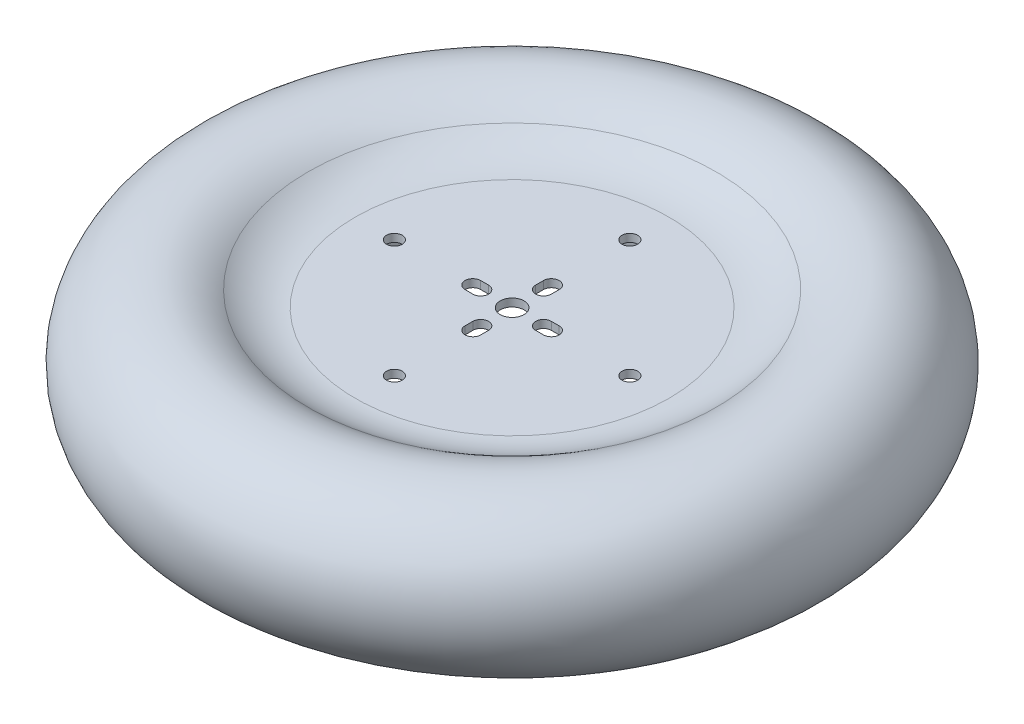
ISO-10303-21;
HEADER;
FILE_DESCRIPTION(('STEP AP214'),'2;1');
FILE_NAME('part.step','',(''),(''),'','','');
FILE_SCHEMA(('AUTOMOTIVE_DESIGN { 1 0 10303 214 1 1 1 1 }'));
ENDSEC;
DATA;
#1=APPLICATION_CONTEXT('core data for automotive mechanical design processes');
#2=APPLICATION_PROTOCOL_DEFINITION('international standard','automotive_design',2000,#1);
#3=PRODUCT_CONTEXT('',#1,'mechanical');
#4=PRODUCT('Part','Part','',(#3));
#5=PRODUCT_RELATED_PRODUCT_CATEGORY('part','',(#4));
#6=PRODUCT_DEFINITION_FORMATION('','',#4);
#7=PRODUCT_DEFINITION_CONTEXT('part definition',#1,'design');
#8=PRODUCT_DEFINITION('design','',#6,#7);
#9=PRODUCT_DEFINITION_SHAPE('','',#8);
#10=(LENGTH_UNIT() NAMED_UNIT(*) SI_UNIT(.MILLI.,.METRE.));
#11=(NAMED_UNIT(*) PLANE_ANGLE_UNIT() SI_UNIT($,.RADIAN.));
#12=(NAMED_UNIT(*) SI_UNIT($,.STERADIAN.) SOLID_ANGLE_UNIT());
#13=UNCERTAINTY_MEASURE_WITH_UNIT(LENGTH_MEASURE(1.E-05),#10,'distance_accuracy_value','');
#14=(GEOMETRIC_REPRESENTATION_CONTEXT(3) GLOBAL_UNCERTAINTY_ASSIGNED_CONTEXT((#13)) GLOBAL_UNIT_ASSIGNED_CONTEXT((#10,
#11,#12)) REPRESENTATION_CONTEXT('',''));
#15=CARTESIAN_POINT('',(0.,0.,0.));
#16=DIRECTION('',(0.,0.,1.));
#17=DIRECTION('',(1.,0.,0.));
#18=AXIS2_PLACEMENT_3D('',#15,#16,#17);
#19=CARTESIAN_POINT('',(0.,30.,0.));
#20=DIRECTION('',(0.,1.,0.));
#21=DIRECTION('',(-1.,0.,0.));
#22=AXIS2_PLACEMENT_3D('',#19,#20,#21);
#23=PLANE('',#22);
#24=CARTESIAN_POINT('',(-74.9999999999994,30.,5.77662917500277E-13));
#25=DIRECTION('',(0.,1.,0.));
#26=DIRECTION('',(-1.,0.,0.));
#27=AXIS2_PLACEMENT_3D('',#24,#25,#26);
#28=CIRCLE('',#27,5.);
#29=CARTESIAN_POINT('',(-79.9999999999994,30.,5.77662917500277E-13));
#30=VERTEX_POINT('',#29);
#31=EDGE_CURVE('E205',#30,#30,#28,.T.);
#32=ORIENTED_EDGE('',*,*,#31,.F.);
#33=EDGE_LOOP('',(#32));
#34=FACE_BOUND('',#33,.T.);
#35=DIRECTION('',(-1.,0.,0.));
#36=VECTOR('',#35,1.);
#37=CARTESIAN_POINT('',(0.,30.,-4.99999999999945));
#38=LINE('',#37,#36);
#39=CARTESIAN_POINT('',(-19.9999999999994,30.,-4.99999999999944));
#40=VERTEX_POINT('',#39);
#41=CARTESIAN_POINT('',(-24.9999999999994,30.,-4.99999999999944));
#42=VERTEX_POINT('',#41);
#43=EDGE_CURVE('E48',#40,#42,#38,.T.);
#44=ORIENTED_EDGE('',*,*,#43,.F.);
#45=CARTESIAN_POINT('',(-19.9999999999994,30.,5.62050406216485E-13));
#46=DIRECTION('',(0.,1.,0.));
#47=DIRECTION('',(-1.,0.,0.));
#48=AXIS2_PLACEMENT_3D('',#45,#46,#47);
#49=CIRCLE('',#48,5.);
#50=CARTESIAN_POINT('',(-19.9999999999994,30.,5.00000000000056));
#51=VERTEX_POINT('',#50);
#52=EDGE_CURVE('E192',#51,#40,#49,.T.);
#53=ORIENTED_EDGE('',*,*,#52,.F.);
#54=DIRECTION('',(-1.,0.,0.));
#55=VECTOR('',#54,1.);
#56=CARTESIAN_POINT('',(0.,30.,5.00000000000056));
#57=LINE('',#56,#55);
#58=CARTESIAN_POINT('',(-24.9999999999994,30.,5.00000000000056));
#59=VERTEX_POINT('',#58);
#60=EDGE_CURVE('E189',#51,#59,#57,.T.);
#61=ORIENTED_EDGE('',*,*,#60,.T.);
#62=CARTESIAN_POINT('',(-24.9999999999994,30.,5.62004792912557E-13));
#63=DIRECTION('',(0.,1.,0.));
#64=DIRECTION('',(-1.,0.,0.));
#65=AXIS2_PLACEMENT_3D('',#62,#63,#64);
#66=CIRCLE('',#65,5.);
#67=EDGE_CURVE('E186',#42,#59,#66,.T.);
#68=ORIENTED_EDGE('',*,*,#67,.F.);
#69=EDGE_LOOP('',(#44,#53,#61,#68));
#70=FACE_BOUND('',#69,.T.);
#71=CARTESIAN_POINT('',(0.,30.,-75.));
#72=DIRECTION('',(0.,1.,0.));
#73=DIRECTION('',(-1.,0.,0.));
#74=AXIS2_PLACEMENT_3D('',#71,#72,#73);
#75=CIRCLE('',#74,5.);
#76=CARTESIAN_POINT('',(-4.99999999999999,30.,-75.));
#77=VERTEX_POINT('',#76);
#78=EDGE_CURVE('E181',#77,#77,#75,.T.);
#79=ORIENTED_EDGE('',*,*,#78,.F.);
#80=EDGE_LOOP('',(#79));
#81=FACE_BOUND('',#80,.T.);
#82=CARTESIAN_POINT('',(1.15095181540636E-12,30.,75.));
#83=DIRECTION('',(0.,1.,0.));
#84=DIRECTION('',(-1.,0.,0.));
#85=AXIS2_PLACEMENT_3D('',#82,#83,#84);
#86=CIRCLE('',#85,5.00000000000001);
#87=CARTESIAN_POINT('',(-4.99999999999886,30.,75.));
#88=VERTEX_POINT('',#87);
#89=EDGE_CURVE('E178',#88,#88,#86,.T.);
#90=ORIENTED_EDGE('',*,*,#89,.F.);
#91=EDGE_LOOP('',(#90));
#92=FACE_BOUND('',#91,.T.);
#93=DIRECTION('',(0.,0.,1.));
#94=VECTOR('',#93,1.);
#95=CARTESIAN_POINT('',(-4.99999999999885,30.,0.));
#96=LINE('',#95,#94);
#97=CARTESIAN_POINT('',(-4.99999999999885,30.,20.));
#98=VERTEX_POINT('',#97);
#99=CARTESIAN_POINT('',(-4.99999999999886,30.,25.));
#100=VERTEX_POINT('',#99);
#101=EDGE_CURVE('E56',#98,#100,#96,.T.);
#102=ORIENTED_EDGE('',*,*,#101,.F.);
#103=CARTESIAN_POINT('',(1.14421625801104E-12,30.,20.));
#104=DIRECTION('',(0.,1.,0.));
#105=DIRECTION('',(-1.,0.,0.));
#106=AXIS2_PLACEMENT_3D('',#103,#104,#105);
#107=CIRCLE('',#106,5.);
#108=CARTESIAN_POINT('',(5.00000000000114,30.,20.));
#109=VERTEX_POINT('',#108);
#110=EDGE_CURVE('E168',#109,#98,#107,.T.);
#111=ORIENTED_EDGE('',*,*,#110,.F.);
#112=DIRECTION('',(0.,0.,1.));
#113=VECTOR('',#112,1.);
#114=CARTESIAN_POINT('',(5.00000000000114,30.,0.));
#115=LINE('',#114,#113);
#116=CARTESIAN_POINT('',(5.00000000000114,30.,25.));
#117=VERTEX_POINT('',#116);
#118=EDGE_CURVE('E152',#109,#117,#115,.T.);
#119=ORIENTED_EDGE('',*,*,#118,.T.);
#120=CARTESIAN_POINT('',(1.14482858141062E-12,30.,25.));
#121=DIRECTION('',(0.,1.,0.));
#122=DIRECTION('',(-1.,0.,0.));
#123=AXIS2_PLACEMENT_3D('',#120,#121,#122);
#124=CIRCLE('',#123,5.);
#125=EDGE_CURVE('E162',#100,#117,#124,.T.);
#126=ORIENTED_EDGE('',*,*,#125,.F.);
#127=EDGE_LOOP('',(#102,#111,#119,#126));
#128=FACE_BOUND('',#127,.T.);
#129=DIRECTION('',(1.,0.,0.));
#130=VECTOR('',#129,1.);
#131=CARTESIAN_POINT('',(0.,30.,4.99999999999947));
#132=LINE('',#131,#130);
#133=CARTESIAN_POINT('',(20.0000000000006,30.,4.99999999999944));
#134=VERTEX_POINT('',#133);
#135=CARTESIAN_POINT('',(25.0000000000006,30.,4.99999999999944));
#136=VERTEX_POINT('',#135);
#137=EDGE_CURVE('E175',#134,#136,#132,.T.);
#138=ORIENTED_EDGE('',*,*,#137,.F.);
#139=CARTESIAN_POINT('',(20.0000000000006,30.,-5.64652491430451E-13));
#140=DIRECTION('',(0.,1.,0.));
#141=DIRECTION('',(-1.,0.,0.));
#142=AXIS2_PLACEMENT_3D('',#139,#140,#141);
#143=CIRCLE('',#142,5.);
#144=CARTESIAN_POINT('',(20.0000000000006,30.,-5.00000000000057));
#145=VERTEX_POINT('',#144);
#146=EDGE_CURVE('E237',#145,#134,#143,.T.);
#147=ORIENTED_EDGE('',*,*,#146,.F.);
#148=DIRECTION('',(1.,0.,0.));
#149=VECTOR('',#148,1.);
#150=CARTESIAN_POINT('',(0.,30.,-5.00000000000058));
#151=LINE('',#150,#149);
#152=CARTESIAN_POINT('',(25.0000000000006,30.,-5.00000000000057));
#153=VERTEX_POINT('',#152);
#154=EDGE_CURVE('E234',#145,#153,#151,.T.);
#155=ORIENTED_EDGE('',*,*,#154,.T.);
#156=CARTESIAN_POINT('',(25.0000000000006,30.,-5.65066409910425E-13));
#157=DIRECTION('',(0.,1.,0.));
#158=DIRECTION('',(-1.,0.,0.));
#159=AXIS2_PLACEMENT_3D('',#156,#157,#158);
#160=CIRCLE('',#159,5.);
#161=EDGE_CURVE('E231',#136,#153,#160,.T.);
#162=ORIENTED_EDGE('',*,*,#161,.F.);
#163=EDGE_LOOP('',(#138,#147,#155,#162));
#164=FACE_BOUND('',#163,.T.);
#165=CARTESIAN_POINT('',(75.0000000000006,29.9999999999999,-5.68121938382404E-13));
#166=DIRECTION('',(0.,1.,0.));
#167=DIRECTION('',(-1.,0.,0.));
#168=AXIS2_PLACEMENT_3D('',#165,#166,#167);
#169=CIRCLE('',#168,5.);
#170=CARTESIAN_POINT('',(70.0000000000006,29.9999999999999,-5.68121938382404E-13));
#171=VERTEX_POINT('',#170);
#172=EDGE_CURVE('E210',#171,#171,#169,.T.);
#173=ORIENTED_EDGE('',*,*,#172,.F.);
#174=EDGE_LOOP('',(#173));
#175=FACE_BOUND('',#174,.T.);
#176=DIRECTION('',(0.,0.,-1.));
#177=VECTOR('',#176,1.);
#178=CARTESIAN_POINT('',(5.00000000000002,30.,0.));
#179=LINE('',#178,#177);
#180=CARTESIAN_POINT('',(5.00000000000002,30.,-20.));
#181=VERTEX_POINT('',#180);
#182=CARTESIAN_POINT('',(5.00000000000002,30.,-25.));
#183=VERTEX_POINT('',#182);
#184=EDGE_CURVE('E207',#181,#183,#179,.T.);
#185=ORIENTED_EDGE('',*,*,#184,.F.);
#186=CARTESIAN_POINT('',(0.,30.,-20.));
#187=DIRECTION('',(0.,1.,0.));
#188=DIRECTION('',(-1.,0.,0.));
#189=AXIS2_PLACEMENT_3D('',#186,#187,#188);
#190=CIRCLE('',#189,5.);
#191=CARTESIAN_POINT('',(-4.99999999999999,30.,-20.));
#192=VERTEX_POINT('',#191);
#193=EDGE_CURVE('E216',#192,#181,#190,.T.);
#194=ORIENTED_EDGE('',*,*,#193,.F.);
#195=DIRECTION('',(0.,0.,-1.));
#196=VECTOR('',#195,1.);
#197=CARTESIAN_POINT('',(-4.99999999999999,30.,0.));
#198=LINE('',#197,#196);
#199=CARTESIAN_POINT('',(-4.99999999999999,30.,-25.));
#200=VERTEX_POINT('',#199);
#201=EDGE_CURVE('E213',#192,#200,#198,.T.);
#202=ORIENTED_EDGE('',*,*,#201,.T.);
#203=CARTESIAN_POINT('',(0.,30.,-25.));
#204=DIRECTION('',(0.,1.,0.));
#205=DIRECTION('',(-1.,0.,0.));
#206=AXIS2_PLACEMENT_3D('',#203,#204,#205);
#207=CIRCLE('',#206,5.);
#208=EDGE_CURVE('E209',#183,#200,#207,.T.);
#209=ORIENTED_EDGE('',*,*,#208,.F.);
#210=EDGE_LOOP('',(#185,#194,#202,#209));
#211=FACE_BOUND('',#210,.T.);
#212=CARTESIAN_POINT('',(0.,30.,0.));
#213=DIRECTION('',(0.,1.,0.));
#214=DIRECTION('',(-1.,0.,0.));
#215=AXIS2_PLACEMENT_3D('',#212,#213,#214);
#216=CIRCLE('',#215,7.59670592104724);
#217=CARTESIAN_POINT('',(-7.59670592104723,30.,0.));
#218=VERTEX_POINT('',#217);
#219=EDGE_CURVE('E202',#218,#218,#216,.T.);
#220=ORIENTED_EDGE('',*,*,#219,.F.);
#221=EDGE_LOOP('',(#220));
#222=FACE_BOUND('',#221,.T.);
#223=CARTESIAN_POINT('',(0.,29.9999999999999,0.));
#224=DIRECTION('',(0.,1.,0.));
#225=DIRECTION('',(-1.,0.,0.));
#226=AXIS2_PLACEMENT_3D('',#223,#224,#225);
#227=CIRCLE('',#226,100.);
#228=CARTESIAN_POINT('',(-100.,30.,0.));
#229=VERTEX_POINT('',#228);
#230=EDGE_CURVE('E257',#229,#229,#227,.T.);
#231=ORIENTED_EDGE('',*,*,#230,.T.);
#232=EDGE_LOOP('',(#231));
#233=FACE_BOUND('',#232,.T.);
#234=ADVANCED_FACE('F33',(#34,#70,#81,#92,#128,#164,#175,#211,#222,#233),#23,.T.);
#235=CARTESIAN_POINT('',(0.,80.,0.));
#236=DIRECTION('',(0.,1.,0.));
#237=DIRECTION('',(-1.,0.,0.));
#238=AXIS2_PLACEMENT_3D('',#235,#236,#237);
#239=TOROIDAL_SURFACE('',#238,100.,50.);
#240=CARTESIAN_POINT('',(0.,39.9999999999999,0.));
#241=DIRECTION('',(0.,1.,0.));
#242=DIRECTION('',(-1.,0.,0.));
#243=AXIS2_PLACEMENT_3D('',#240,#241,#242);
#244=CIRCLE('',#243,130.);
#245=CARTESIAN_POINT('',(-130.,40.,0.));
#246=VERTEX_POINT('',#245);
#247=EDGE_CURVE('E254',#246,#246,#244,.T.);
#248=ORIENTED_EDGE('',*,*,#247,.T.);
#249=EDGE_LOOP('',(#248));
#250=FACE_BOUND('',#249,.T.);
#251=ORIENTED_EDGE('',*,*,#230,.F.);
#252=EDGE_LOOP('',(#251));
#253=FACE_BOUND('',#252,.T.);
#254=ADVANCED_FACE('F324',(#250,#253),#239,.F.);
#255=CARTESIAN_POINT('',(0.,0.,0.));
#256=DIRECTION('',(0.,1.,0.));
#257=DIRECTION('',(-1.,0.,0.));
#258=AXIS2_PLACEMENT_3D('',#255,#256,#257);
#259=TOROIDAL_SURFACE('',#258,160.,50.);
#260=CARTESIAN_POINT('',(0.,0.,0.));
#261=DIRECTION('',(0.,1.,0.));
#262=DIRECTION('',(-1.,0.,0.));
#263=AXIS2_PLACEMENT_3D('',#260,#261,#262);
#264=CIRCLE('',#263,110.);
#265=CARTESIAN_POINT('',(-110.,0.,0.));
#266=VERTEX_POINT('',#265);
#267=EDGE_CURVE('E251',#266,#266,#264,.T.);
#268=ORIENTED_EDGE('',*,*,#267,.T.);
#269=EDGE_LOOP('',(#268));
#270=FACE_BOUND('',#269,.T.);
#271=ORIENTED_EDGE('',*,*,#247,.F.);
#272=EDGE_LOOP('',(#271));
#273=FACE_BOUND('',#272,.T.);
#274=ADVANCED_FACE('F400',(#270,#273),#259,.T.);
#275=CARTESIAN_POINT('',(0.,0.,0.));
#276=DIRECTION('',(0.,1.,0.));
#277=DIRECTION('',(-1.,0.,0.));
#278=AXIS2_PLACEMENT_3D('',#275,#276,#277);
#279=TOROIDAL_SURFACE('',#278,85.,25.);
#280=CARTESIAN_POINT('',(0.,25.,0.));
#281=DIRECTION('',(0.,1.,0.));
#282=DIRECTION('',(-1.,0.,0.));
#283=AXIS2_PLACEMENT_3D('',#280,#281,#282);
#284=CIRCLE('',#283,85.);
#285=CARTESIAN_POINT('',(-85.,25.,0.));
#286=VERTEX_POINT('',#285);
#287=EDGE_CURVE('E248',#286,#286,#284,.T.);
#288=ORIENTED_EDGE('',*,*,#287,.T.);
#289=EDGE_LOOP('',(#288));
#290=FACE_BOUND('',#289,.T.);
#291=ORIENTED_EDGE('',*,*,#267,.F.);
#292=EDGE_LOOP('',(#291));
#293=FACE_BOUND('',#292,.T.);
#294=ADVANCED_FACE('F396',(#290,#293),#279,.F.);
#295=CARTESIAN_POINT('',(-85.,25.,0.));
#296=DIRECTION('',(0.,-1.,0.));
#297=DIRECTION('',(1.,0.,0.));
#298=AXIS2_PLACEMENT_3D('',#295,#296,#297);
#299=PLANE('',#298);
#300=CARTESIAN_POINT('',(-74.9999999999994,25.,5.77662917500277E-13));
#301=DIRECTION('',(0.,-1.,0.));
#302=DIRECTION('',(1.,0.,0.));
#303=AXIS2_PLACEMENT_3D('',#300,#301,#302);
#304=CIRCLE('',#303,5.);
#305=CARTESIAN_POINT('',(-69.9999999999994,25.,5.77662917500277E-13));
#306=VERTEX_POINT('',#305);
#307=EDGE_CURVE('E36',#306,#306,#304,.T.);
#308=ORIENTED_EDGE('',*,*,#307,.F.);
#309=EDGE_LOOP('',(#308));
#310=FACE_BOUND('',#309,.T.);
#311=DIRECTION('',(1.,0.,0.));
#312=VECTOR('',#311,1.);
#313=CARTESIAN_POINT('',(-85.,25.,-4.99999999999942));
#314=LINE('',#313,#312);
#315=CARTESIAN_POINT('',(-24.9999999999994,25.,-4.99999999999944));
#316=VERTEX_POINT('',#315);
#317=CARTESIAN_POINT('',(-19.9999999999994,25.,-4.99999999999944));
#318=VERTEX_POINT('',#317);
#319=EDGE_CURVE('E11',#316,#318,#314,.T.);
#320=ORIENTED_EDGE('',*,*,#319,.F.);
#321=CARTESIAN_POINT('',(-24.9999999999994,25.,5.62004792912557E-13));
#322=DIRECTION('',(0.,-1.,0.));
#323=DIRECTION('',(1.,0.,0.));
#324=AXIS2_PLACEMENT_3D('',#321,#322,#323);
#325=CIRCLE('',#324,5.);
#326=CARTESIAN_POINT('',(-24.9999999999994,25.,5.00000000000056));
#327=VERTEX_POINT('',#326);
#328=EDGE_CURVE('E292',#327,#316,#325,.T.);
#329=ORIENTED_EDGE('',*,*,#328,.F.);
#330=DIRECTION('',(1.,0.,0.));
#331=VECTOR('',#330,1.);
#332=CARTESIAN_POINT('',(-85.,25.,5.00000000000058));
#333=LINE('',#332,#331);
#334=CARTESIAN_POINT('',(-19.9999999999994,25.,5.00000000000056));
#335=VERTEX_POINT('',#334);
#336=EDGE_CURVE('E299',#327,#335,#333,.T.);
#337=ORIENTED_EDGE('',*,*,#336,.T.);
#338=CARTESIAN_POINT('',(-19.9999999999994,25.,5.62050406216485E-13));
#339=DIRECTION('',(0.,-1.,0.));
#340=DIRECTION('',(1.,0.,0.));
#341=AXIS2_PLACEMENT_3D('',#338,#339,#340);
#342=CIRCLE('',#341,5.);
#343=EDGE_CURVE('E41',#318,#335,#342,.T.);
#344=ORIENTED_EDGE('',*,*,#343,.F.);
#345=EDGE_LOOP('',(#320,#329,#337,#344));
#346=FACE_BOUND('',#345,.T.);
#347=CARTESIAN_POINT('',(0.,25.,-75.));
#348=DIRECTION('',(0.,-1.,0.));
#349=DIRECTION('',(1.,0.,0.));
#350=AXIS2_PLACEMENT_3D('',#347,#348,#349);
#351=CIRCLE('',#350,5.);
#352=CARTESIAN_POINT('',(5.00000000000002,25.,-75.));
#353=VERTEX_POINT('',#352);
#354=EDGE_CURVE('E295',#353,#353,#351,.T.);
#355=ORIENTED_EDGE('',*,*,#354,.F.);
#356=EDGE_LOOP('',(#355));
#357=FACE_BOUND('',#356,.T.);
#358=CARTESIAN_POINT('',(1.14850252180806E-12,25.,75.));
#359=DIRECTION('',(0.,-1.,0.));
#360=DIRECTION('',(1.,0.,0.));
#361=AXIS2_PLACEMENT_3D('',#358,#359,#360);
#362=CIRCLE('',#361,5.00000000000001);
#363=CARTESIAN_POINT('',(5.00000000000116,25.,75.));
#364=VERTEX_POINT('',#363);
#365=EDGE_CURVE('E276',#364,#364,#362,.T.);
#366=ORIENTED_EDGE('',*,*,#365,.F.);
#367=EDGE_LOOP('',(#366));
#368=FACE_BOUND('',#367,.T.);
#369=DIRECTION('',(0.,0.,-1.));
#370=VECTOR('',#369,1.);
#371=CARTESIAN_POINT('',(-4.99999999999885,25.,0.));
#372=LINE('',#371,#370);
#373=CARTESIAN_POINT('',(-4.99999999999886,25.,25.));
#374=VERTEX_POINT('',#373);
#375=CARTESIAN_POINT('',(-4.99999999999886,25.,20.));
#376=VERTEX_POINT('',#375);
#377=EDGE_CURVE('E290',#374,#376,#372,.T.);
#378=ORIENTED_EDGE('',*,*,#377,.F.);
#379=CARTESIAN_POINT('',(1.14237928781232E-12,25.,25.));
#380=DIRECTION('',(0.,-1.,0.));
#381=DIRECTION('',(1.,0.,0.));
#382=AXIS2_PLACEMENT_3D('',#379,#380,#381);
#383=CIRCLE('',#382,5.);
#384=CARTESIAN_POINT('',(5.00000000000114,25.,25.));
#385=VERTEX_POINT('',#384);
#386=EDGE_CURVE('E285',#385,#374,#383,.T.);
#387=ORIENTED_EDGE('',*,*,#386,.F.);
#388=DIRECTION('',(0.,0.,-1.));
#389=VECTOR('',#388,1.);
#390=CARTESIAN_POINT('',(5.00000000000113,25.,0.));
#391=LINE('',#390,#389);
#392=CARTESIAN_POINT('',(5.00000000000114,25.,20.));
#393=VERTEX_POINT('',#392);
#394=EDGE_CURVE('E155',#385,#393,#391,.T.);
#395=ORIENTED_EDGE('',*,*,#394,.T.);
#396=CARTESIAN_POINT('',(1.14176696441275E-12,25.,20.));
#397=DIRECTION('',(0.,-1.,0.));
#398=DIRECTION('',(1.,0.,0.));
#399=AXIS2_PLACEMENT_3D('',#396,#397,#398);
#400=CIRCLE('',#399,5.);
#401=EDGE_CURVE('E288',#376,#393,#400,.T.);
#402=ORIENTED_EDGE('',*,*,#401,.F.);
#403=EDGE_LOOP('',(#378,#387,#395,#402));
#404=FACE_BOUND('',#403,.T.);
#405=DIRECTION('',(-1.,0.,0.));
#406=VECTOR('',#405,1.);
#407=CARTESIAN_POINT('',(-85.,25.,4.99999999999959));
#408=LINE('',#407,#406);
#409=CARTESIAN_POINT('',(25.0000000000006,25.,4.99999999999943));
#410=VERTEX_POINT('',#409);
#411=CARTESIAN_POINT('',(20.0000000000006,25.,4.99999999999944));
#412=VERTEX_POINT('',#411);
#413=EDGE_CURVE('E283',#410,#412,#408,.T.);
#414=ORIENTED_EDGE('',*,*,#413,.F.);
#415=CARTESIAN_POINT('',(25.0000000000006,25.,-5.65066409910425E-13));
#416=DIRECTION('',(0.,-1.,0.));
#417=DIRECTION('',(1.,0.,0.));
#418=AXIS2_PLACEMENT_3D('',#415,#416,#417);
#419=CIRCLE('',#418,5.);
#420=CARTESIAN_POINT('',(25.0000000000006,25.,-5.00000000000056));
#421=VERTEX_POINT('',#420);
#422=EDGE_CURVE('E273',#421,#410,#419,.T.);
#423=ORIENTED_EDGE('',*,*,#422,.F.);
#424=DIRECTION('',(-1.,0.,0.));
#425=VECTOR('',#424,1.);
#426=CARTESIAN_POINT('',(-85.,25.,-5.0000000000006));
#427=LINE('',#426,#425);
#428=CARTESIAN_POINT('',(20.0000000000006,25.,-5.00000000000057));
#429=VERTEX_POINT('',#428);
#430=EDGE_CURVE('E278',#421,#429,#427,.T.);
#431=ORIENTED_EDGE('',*,*,#430,.T.);
#432=CARTESIAN_POINT('',(20.0000000000006,25.,-5.64652491430451E-13));
#433=DIRECTION('',(0.,-1.,0.));
#434=DIRECTION('',(1.,0.,0.));
#435=AXIS2_PLACEMENT_3D('',#432,#433,#434);
#436=CIRCLE('',#435,5.);
#437=EDGE_CURVE('E281',#412,#429,#436,.T.);
#438=ORIENTED_EDGE('',*,*,#437,.F.);
#439=EDGE_LOOP('',(#414,#423,#431,#438));
#440=FACE_BOUND('',#439,.T.);
#441=CARTESIAN_POINT('',(75.0000000000006,24.9999999999999,-5.68121938382404E-13));
#442=DIRECTION('',(0.,-1.,0.));
#443=DIRECTION('',(1.,0.,0.));
#444=AXIS2_PLACEMENT_3D('',#441,#442,#443);
#445=CIRCLE('',#444,5.);
#446=CARTESIAN_POINT('',(80.0000000000006,24.9999999999999,-5.68121938382404E-13));
#447=VERTEX_POINT('',#446);
#448=EDGE_CURVE('E264',#447,#447,#445,.T.);
#449=ORIENTED_EDGE('',*,*,#448,.F.);
#450=EDGE_LOOP('',(#449));
#451=FACE_BOUND('',#450,.T.);
#452=DIRECTION('',(0.,0.,1.));
#453=VECTOR('',#452,1.);
#454=CARTESIAN_POINT('',(5.,25.,0.));
#455=LINE('',#454,#453);
#456=CARTESIAN_POINT('',(5.00000000000001,25.,-25.));
#457=VERTEX_POINT('',#456);
#458=CARTESIAN_POINT('',(5.00000000000001,25.,-20.));
#459=VERTEX_POINT('',#458);
#460=EDGE_CURVE('E271',#457,#459,#455,.T.);
#461=ORIENTED_EDGE('',*,*,#460,.F.);
#462=CARTESIAN_POINT('',(0.,25.,-25.));
#463=DIRECTION('',(0.,-1.,0.));
#464=DIRECTION('',(1.,0.,0.));
#465=AXIS2_PLACEMENT_3D('',#462,#463,#464);
#466=CIRCLE('',#465,5.);
#467=CARTESIAN_POINT('',(-4.99999999999999,25.,-25.));
#468=VERTEX_POINT('',#467);
#469=EDGE_CURVE('E260',#468,#457,#466,.T.);
#470=ORIENTED_EDGE('',*,*,#469,.F.);
#471=DIRECTION('',(0.,0.,1.));
#472=VECTOR('',#471,1.);
#473=CARTESIAN_POINT('',(-4.99999999999999,25.,0.));
#474=LINE('',#473,#472);
#475=CARTESIAN_POINT('',(-4.99999999999999,25.,-20.));
#476=VERTEX_POINT('',#475);
#477=EDGE_CURVE('E266',#468,#476,#474,.T.);
#478=ORIENTED_EDGE('',*,*,#477,.T.);
#479=CARTESIAN_POINT('',(0.,25.,-20.));
#480=DIRECTION('',(0.,-1.,0.));
#481=DIRECTION('',(1.,0.,0.));
#482=AXIS2_PLACEMENT_3D('',#479,#480,#481);
#483=CIRCLE('',#482,5.);
#484=EDGE_CURVE('E269',#459,#476,#483,.T.);
#485=ORIENTED_EDGE('',*,*,#484,.F.);
#486=EDGE_LOOP('',(#461,#470,#478,#485));
#487=FACE_BOUND('',#486,.T.);
#488=CARTESIAN_POINT('',(0.,25.,0.));
#489=DIRECTION('',(0.,-1.,0.));
#490=DIRECTION('',(1.,0.,0.));
#491=AXIS2_PLACEMENT_3D('',#488,#489,#490);
#492=CIRCLE('',#491,7.59670592104724);
#493=CARTESIAN_POINT('',(7.59670592104725,25.,0.));
#494=VERTEX_POINT('',#493);
#495=EDGE_CURVE('E261',#494,#494,#492,.T.);
#496=ORIENTED_EDGE('',*,*,#495,.F.);
#497=EDGE_LOOP('',(#496));
#498=FACE_BOUND('',#497,.T.);
#499=ORIENTED_EDGE('',*,*,#287,.F.);
#500=EDGE_LOOP('',(#499));
#501=FACE_BOUND('',#500,.T.);
#502=ADVANCED_FACE('F315',(#310,#346,#357,#368,#404,#440,#451,#487,#498,#501),#299,.T.);
#503=CARTESIAN_POINT('',(0.,20.,0.));
#504=DIRECTION('',(0.,1.,0.));
#505=DIRECTION('',(-1.,0.,0.));
#506=AXIS2_PLACEMENT_3D('',#503,#504,#505);
#507=CYLINDRICAL_SURFACE('',#506,7.59670592104724);
#508=ORIENTED_EDGE('',*,*,#495,.T.);
#509=EDGE_LOOP('',(#508));
#510=FACE_BOUND('',#509,.T.);
#511=ORIENTED_EDGE('',*,*,#219,.T.);
#512=EDGE_LOOP('',(#511));
#513=FACE_BOUND('',#512,.T.);
#514=ADVANCED_FACE('F354',(#510,#513),#507,.F.);
#515=CARTESIAN_POINT('',(5.00000000000001,20.,0.));
#516=DIRECTION('',(1.,0.,0.));
#517=DIRECTION('',(0.,1.,0.));
#518=AXIS2_PLACEMENT_3D('',#515,#516,#517);
#519=PLANE('',#518);
#520=ORIENTED_EDGE('',*,*,#460,.T.);
#521=DIRECTION('',(0.,1.,0.));
#522=VECTOR('',#521,1.);
#523=CARTESIAN_POINT('',(5.00000000000001,20.,-20.));
#524=LINE('',#523,#522);
#525=EDGE_CURVE('E206',#459,#181,#524,.T.);
#526=ORIENTED_EDGE('',*,*,#525,.T.);
#527=ORIENTED_EDGE('',*,*,#184,.T.);
#528=DIRECTION('',(0.,1.,0.));
#529=VECTOR('',#528,1.);
#530=CARTESIAN_POINT('',(5.00000000000001,20.,-25.));
#531=LINE('',#530,#529);
#532=EDGE_CURVE('E219',#457,#183,#531,.T.);
#533=ORIENTED_EDGE('',*,*,#532,.F.);
#534=EDGE_LOOP('',(#520,#526,#527,#533));
#535=FACE_BOUND('',#534,.T.);
#536=ADVANCED_FACE('F357',(#535),#519,.F.);
#537=CARTESIAN_POINT('',(0.,20.,-20.));
#538=DIRECTION('',(0.,1.,0.));
#539=DIRECTION('',(-1.,0.,0.));
#540=AXIS2_PLACEMENT_3D('',#537,#538,#539);
#541=CYLINDRICAL_SURFACE('',#540,5.);
#542=ORIENTED_EDGE('',*,*,#484,.T.);
#543=DIRECTION('',(0.,1.,0.));
#544=VECTOR('',#543,1.);
#545=CARTESIAN_POINT('',(-4.99999999999999,20.,-20.));
#546=LINE('',#545,#544);
#547=EDGE_CURVE('E221',#476,#192,#546,.T.);
#548=ORIENTED_EDGE('',*,*,#547,.T.);
#549=ORIENTED_EDGE('',*,*,#193,.T.);
#550=ORIENTED_EDGE('',*,*,#525,.F.);
#551=EDGE_LOOP('',(#542,#548,#549,#550));
#552=FACE_BOUND('',#551,.T.);
#553=ADVANCED_FACE('F359',(#552),#541,.F.);
#554=CARTESIAN_POINT('',(-4.99999999999999,20.,0.));
#555=DIRECTION('',(1.,0.,0.));
#556=DIRECTION('',(0.,1.,0.));
#557=AXIS2_PLACEMENT_3D('',#554,#555,#556);
#558=PLANE('',#557);
#559=DIRECTION('',(0.,1.,0.));
#560=VECTOR('',#559,1.);
#561=CARTESIAN_POINT('',(-4.99999999999999,20.,-25.));
#562=LINE('',#561,#560);
#563=EDGE_CURVE('E223',#468,#200,#562,.T.);
#564=ORIENTED_EDGE('',*,*,#563,.T.);
#565=ORIENTED_EDGE('',*,*,#201,.F.);
#566=ORIENTED_EDGE('',*,*,#547,.F.);
#567=ORIENTED_EDGE('',*,*,#477,.F.);
#568=EDGE_LOOP('',(#564,#565,#566,#567));
#569=FACE_BOUND('',#568,.T.);
#570=ADVANCED_FACE('F362',(#569),#558,.T.);
#571=CARTESIAN_POINT('',(0.,20.,-25.));
#572=DIRECTION('',(0.,1.,0.));
#573=DIRECTION('',(-1.,0.,0.));
#574=AXIS2_PLACEMENT_3D('',#571,#572,#573);
#575=CYLINDRICAL_SURFACE('',#574,5.);
#576=ORIENTED_EDGE('',*,*,#469,.T.);
#577=ORIENTED_EDGE('',*,*,#532,.T.);
#578=ORIENTED_EDGE('',*,*,#208,.T.);
#579=ORIENTED_EDGE('',*,*,#563,.F.);
#580=EDGE_LOOP('',(#576,#577,#578,#579));
#581=FACE_BOUND('',#580,.T.);
#582=ADVANCED_FACE('F366',(#581),#575,.F.);
#583=CARTESIAN_POINT('',(75.0000000000006,19.9999999999999,-5.68121938382404E-13));
#584=DIRECTION('',(0.,1.,0.));
#585=DIRECTION('',(-1.,0.,0.));
#586=AXIS2_PLACEMENT_3D('',#583,#584,#585);
#587=CYLINDRICAL_SURFACE('',#586,5.);
#588=ORIENTED_EDGE('',*,*,#448,.T.);
#589=EDGE_LOOP('',(#588));
#590=FACE_BOUND('',#589,.T.);
#591=ORIENTED_EDGE('',*,*,#172,.T.);
#592=EDGE_LOOP('',(#591));
#593=FACE_BOUND('',#592,.T.);
#594=ADVANCED_FACE('F370',(#590,#593),#587,.F.);
#595=CARTESIAN_POINT('',(0.,20.,4.99999999999947));
#596=DIRECTION('',(0.,0.,1.));
#597=DIRECTION('',(1.,0.,0.));
#598=AXIS2_PLACEMENT_3D('',#595,#596,#597);
#599=PLANE('',#598);
#600=ORIENTED_EDGE('',*,*,#413,.T.);
#601=DIRECTION('',(0.,1.,0.));
#602=VECTOR('',#601,1.);
#603=CARTESIAN_POINT('',(20.0000000000006,20.,4.99999999999944));
#604=LINE('',#603,#602);
#605=EDGE_CURVE('E229',#412,#134,#604,.T.);
#606=ORIENTED_EDGE('',*,*,#605,.T.);
#607=ORIENTED_EDGE('',*,*,#137,.T.);
#608=DIRECTION('',(0.,1.,0.));
#609=VECTOR('',#608,1.);
#610=CARTESIAN_POINT('',(25.0000000000006,20.,4.99999999999943));
#611=LINE('',#610,#609);
#612=EDGE_CURVE('E240',#410,#136,#611,.T.);
#613=ORIENTED_EDGE('',*,*,#612,.F.);
#614=EDGE_LOOP('',(#600,#606,#607,#613));
#615=FACE_BOUND('',#614,.T.);
#616=ADVANCED_FACE('F377',(#615),#599,.F.);
#617=CARTESIAN_POINT('',(20.0000000000006,20.,-5.64652491430451E-13));
#618=DIRECTION('',(0.,1.,0.));
#619=DIRECTION('',(-1.,0.,0.));
#620=AXIS2_PLACEMENT_3D('',#617,#618,#619);
#621=CYLINDRICAL_SURFACE('',#620,5.);
#622=ORIENTED_EDGE('',*,*,#437,.T.);
#623=DIRECTION('',(0.,1.,0.));
#624=VECTOR('',#623,1.);
#625=CARTESIAN_POINT('',(20.0000000000006,20.,-5.00000000000057));
#626=LINE('',#625,#624);
#627=EDGE_CURVE('E242',#429,#145,#626,.T.);
#628=ORIENTED_EDGE('',*,*,#627,.T.);
#629=ORIENTED_EDGE('',*,*,#146,.T.);
#630=ORIENTED_EDGE('',*,*,#605,.F.);
#631=EDGE_LOOP('',(#622,#628,#629,#630));
#632=FACE_BOUND('',#631,.T.);
#633=ADVANCED_FACE('F379',(#632),#621,.F.);
#634=CARTESIAN_POINT('',(0.,20.,-5.00000000000058));
#635=DIRECTION('',(0.,0.,1.));
#636=DIRECTION('',(1.,0.,0.));
#637=AXIS2_PLACEMENT_3D('',#634,#635,#636);
#638=PLANE('',#637);
#639=DIRECTION('',(0.,1.,0.));
#640=VECTOR('',#639,1.);
#641=CARTESIAN_POINT('',(25.0000000000006,20.,-5.00000000000057));
#642=LINE('',#641,#640);
#643=EDGE_CURVE('E244',#421,#153,#642,.T.);
#644=ORIENTED_EDGE('',*,*,#643,.T.);
#645=ORIENTED_EDGE('',*,*,#154,.F.);
#646=ORIENTED_EDGE('',*,*,#627,.F.);
#647=ORIENTED_EDGE('',*,*,#430,.F.);
#648=EDGE_LOOP('',(#644,#645,#646,#647));
#649=FACE_BOUND('',#648,.T.);
#650=ADVANCED_FACE('F382',(#649),#638,.T.);
#651=CARTESIAN_POINT('',(25.0000000000006,20.,-5.65066409910425E-13));
#652=DIRECTION('',(0.,1.,0.));
#653=DIRECTION('',(-1.,0.,0.));
#654=AXIS2_PLACEMENT_3D('',#651,#652,#653);
#655=CYLINDRICAL_SURFACE('',#654,5.);
#656=ORIENTED_EDGE('',*,*,#422,.T.);
#657=ORIENTED_EDGE('',*,*,#612,.T.);
#658=ORIENTED_EDGE('',*,*,#161,.T.);
#659=ORIENTED_EDGE('',*,*,#643,.F.);
#660=EDGE_LOOP('',(#656,#657,#658,#659));
#661=FACE_BOUND('',#660,.T.);
#662=ADVANCED_FACE('F386',(#661),#655,.F.);
#663=CARTESIAN_POINT('',(-4.99999999999885,20.,0.));
#664=DIRECTION('',(-1.,0.,0.));
#665=DIRECTION('',(0.,-1.,0.));
#666=AXIS2_PLACEMENT_3D('',#663,#664,#665);
#667=PLANE('',#666);
#668=ORIENTED_EDGE('',*,*,#377,.T.);
#669=DIRECTION('',(0.,1.,0.));
#670=VECTOR('',#669,1.);
#671=CARTESIAN_POINT('',(-4.99999999999886,20.,20.));
#672=LINE('',#671,#670);
#673=EDGE_CURVE('E173',#376,#98,#672,.T.);
#674=ORIENTED_EDGE('',*,*,#673,.T.);
#675=ORIENTED_EDGE('',*,*,#101,.T.);
#676=DIRECTION('',(0.,1.,0.));
#677=VECTOR('',#676,1.);
#678=CARTESIAN_POINT('',(-4.99999999999886,20.,25.));
#679=LINE('',#678,#677);
#680=EDGE_CURVE('E159',#374,#100,#679,.T.);
#681=ORIENTED_EDGE('',*,*,#680,.F.);
#682=EDGE_LOOP('',(#668,#674,#675,#681));
#683=FACE_BOUND('',#682,.T.);
#684=ADVANCED_FACE('F343',(#683),#667,.F.);
#685=CARTESIAN_POINT('',(1.13931767081446E-12,20.,20.));
#686=DIRECTION('',(0.,1.,0.));
#687=DIRECTION('',(-1.,0.,0.));
#688=AXIS2_PLACEMENT_3D('',#685,#686,#687);
#689=CYLINDRICAL_SURFACE('',#688,5.);
#690=ORIENTED_EDGE('',*,*,#401,.T.);
#691=DIRECTION('',(0.,1.,0.));
#692=VECTOR('',#691,1.);
#693=CARTESIAN_POINT('',(5.00000000000114,20.,20.));
#694=LINE('',#693,#692);
#695=EDGE_CURVE('E158',#393,#109,#694,.T.);
#696=ORIENTED_EDGE('',*,*,#695,.T.);
#697=ORIENTED_EDGE('',*,*,#110,.T.);
#698=ORIENTED_EDGE('',*,*,#673,.F.);
#699=EDGE_LOOP('',(#690,#696,#697,#698));
#700=FACE_BOUND('',#699,.T.);
#701=ADVANCED_FACE('F473',(#700),#689,.F.);
#702=CARTESIAN_POINT('',(5.00000000000113,20.,0.));
#703=DIRECTION('',(-1.,0.,0.));
#704=DIRECTION('',(0.,-1.,0.));
#705=AXIS2_PLACEMENT_3D('',#702,#703,#704);
#706=PLANE('',#705);
#707=DIRECTION('',(0.,1.,0.));
#708=VECTOR('',#707,1.);
#709=CARTESIAN_POINT('',(5.00000000000114,20.,25.));
#710=LINE('',#709,#708);
#711=EDGE_CURVE('E147',#385,#117,#710,.T.);
#712=ORIENTED_EDGE('',*,*,#711,.T.);
#713=ORIENTED_EDGE('',*,*,#118,.F.);
#714=ORIENTED_EDGE('',*,*,#695,.F.);
#715=ORIENTED_EDGE('',*,*,#394,.F.);
#716=EDGE_LOOP('',(#712,#713,#714,#715));
#717=FACE_BOUND('',#716,.T.);
#718=ADVANCED_FACE('F149',(#717),#706,.T.);
#719=CARTESIAN_POINT('',(1.13992999421403E-12,20.,25.));
#720=DIRECTION('',(0.,1.,0.));
#721=DIRECTION('',(-1.,0.,0.));
#722=AXIS2_PLACEMENT_3D('',#719,#720,#721);
#723=CYLINDRICAL_SURFACE('',#722,5.);
#724=ORIENTED_EDGE('',*,*,#386,.T.);
#725=ORIENTED_EDGE('',*,*,#680,.T.);
#726=ORIENTED_EDGE('',*,*,#125,.T.);
#727=ORIENTED_EDGE('',*,*,#711,.F.);
#728=EDGE_LOOP('',(#724,#725,#726,#727));
#729=FACE_BOUND('',#728,.T.);
#730=ADVANCED_FACE('F163',(#729),#723,.F.);
#731=CARTESIAN_POINT('',(1.14605322820977E-12,20.,75.));
#732=DIRECTION('',(0.,1.,0.));
#733=DIRECTION('',(-1.,0.,0.));
#734=AXIS2_PLACEMENT_3D('',#731,#732,#733);
#735=CYLINDRICAL_SURFACE('',#734,5.00000000000001);
#736=ORIENTED_EDGE('',*,*,#365,.T.);
#737=EDGE_LOOP('',(#736));
#738=FACE_BOUND('',#737,.T.);
#739=ORIENTED_EDGE('',*,*,#89,.T.);
#740=EDGE_LOOP('',(#739));
#741=FACE_BOUND('',#740,.T.);
#742=ADVANCED_FACE('F330',(#738,#741),#735,.F.);
#743=CARTESIAN_POINT('',(0.,20.,-75.));
#744=DIRECTION('',(0.,1.,0.));
#745=DIRECTION('',(-1.,0.,0.));
#746=AXIS2_PLACEMENT_3D('',#743,#744,#745);
#747=CYLINDRICAL_SURFACE('',#746,5.);
#748=ORIENTED_EDGE('',*,*,#354,.T.);
#749=EDGE_LOOP('',(#748));
#750=FACE_BOUND('',#749,.T.);
#751=ORIENTED_EDGE('',*,*,#78,.T.);
#752=EDGE_LOOP('',(#751));
#753=FACE_BOUND('',#752,.T.);
#754=ADVANCED_FACE('F332',(#750,#753),#747,.F.);
#755=CARTESIAN_POINT('',(0.,20.,-4.99999999999945));
#756=DIRECTION('',(0.,0.,-1.));
#757=DIRECTION('',(-1.,0.,0.));
#758=AXIS2_PLACEMENT_3D('',#755,#756,#757);
#759=PLANE('',#758);
#760=ORIENTED_EDGE('',*,*,#319,.T.);
#761=DIRECTION('',(0.,1.,0.));
#762=VECTOR('',#761,1.);
#763=CARTESIAN_POINT('',(-19.9999999999994,20.,-4.99999999999944));
#764=LINE('',#763,#762);
#765=EDGE_CURVE('E184',#318,#40,#764,.T.);
#766=ORIENTED_EDGE('',*,*,#765,.T.);
#767=ORIENTED_EDGE('',*,*,#43,.T.);
#768=DIRECTION('',(0.,1.,0.));
#769=VECTOR('',#768,1.);
#770=CARTESIAN_POINT('',(-24.9999999999994,20.,-4.99999999999944));
#771=LINE('',#770,#769);
#772=EDGE_CURVE('E195',#316,#42,#771,.T.);
#773=ORIENTED_EDGE('',*,*,#772,.F.);
#774=EDGE_LOOP('',(#760,#766,#767,#773));
#775=FACE_BOUND('',#774,.T.);
#776=ADVANCED_FACE('F320',(#775),#759,.F.);
#777=CARTESIAN_POINT('',(-19.9999999999994,20.,5.62050406216485E-13));
#778=DIRECTION('',(0.,1.,0.));
#779=DIRECTION('',(-1.,0.,0.));
#780=AXIS2_PLACEMENT_3D('',#777,#778,#779);
#781=CYLINDRICAL_SURFACE('',#780,5.);
#782=ORIENTED_EDGE('',*,*,#343,.T.);
#783=DIRECTION('',(0.,1.,0.));
#784=VECTOR('',#783,1.);
#785=CARTESIAN_POINT('',(-19.9999999999994,20.,5.00000000000056));
#786=LINE('',#785,#784);
#787=EDGE_CURVE('E197',#335,#51,#786,.T.);
#788=ORIENTED_EDGE('',*,*,#787,.T.);
#789=ORIENTED_EDGE('',*,*,#52,.T.);
#790=ORIENTED_EDGE('',*,*,#765,.F.);
#791=EDGE_LOOP('',(#782,#788,#789,#790));
#792=FACE_BOUND('',#791,.T.);
#793=ADVANCED_FACE('F306',(#792),#781,.F.);
#794=CARTESIAN_POINT('',(0.,20.,5.00000000000056));
#795=DIRECTION('',(0.,0.,-1.));
#796=DIRECTION('',(-1.,0.,0.));
#797=AXIS2_PLACEMENT_3D('',#794,#795,#796);
#798=PLANE('',#797);
#799=DIRECTION('',(0.,1.,0.));
#800=VECTOR('',#799,1.);
#801=CARTESIAN_POINT('',(-24.9999999999994,20.,5.00000000000056));
#802=LINE('',#801,#800);
#803=EDGE_CURVE('E199',#327,#59,#802,.T.);
#804=ORIENTED_EDGE('',*,*,#803,.T.);
#805=ORIENTED_EDGE('',*,*,#60,.F.);
#806=ORIENTED_EDGE('',*,*,#787,.F.);
#807=ORIENTED_EDGE('',*,*,#336,.F.);
#808=EDGE_LOOP('',(#804,#805,#806,#807));
#809=FACE_BOUND('',#808,.T.);
#810=ADVANCED_FACE('F312',(#809),#798,.T.);
#811=CARTESIAN_POINT('',(-24.9999999999994,20.,5.62004792912557E-13));
#812=DIRECTION('',(0.,1.,0.));
#813=DIRECTION('',(-1.,0.,0.));
#814=AXIS2_PLACEMENT_3D('',#811,#812,#813);
#815=CYLINDRICAL_SURFACE('',#814,5.);
#816=ORIENTED_EDGE('',*,*,#328,.T.);
#817=ORIENTED_EDGE('',*,*,#772,.T.);
#818=ORIENTED_EDGE('',*,*,#67,.T.);
#819=ORIENTED_EDGE('',*,*,#803,.F.);
#820=EDGE_LOOP('',(#816,#817,#818,#819));
#821=FACE_BOUND('',#820,.T.);
#822=ADVANCED_FACE('F318',(#821),#815,.F.);
#823=CARTESIAN_POINT('',(-74.9999999999994,20.,5.77662917500277E-13));
#824=DIRECTION('',(0.,1.,0.));
#825=DIRECTION('',(-1.,0.,0.));
#826=AXIS2_PLACEMENT_3D('',#823,#824,#825);
#827=CYLINDRICAL_SURFACE('',#826,5.);
#828=ORIENTED_EDGE('',*,*,#307,.T.);
#829=EDGE_LOOP('',(#828));
#830=FACE_BOUND('',#829,.T.);
#831=ORIENTED_EDGE('',*,*,#31,.T.);
#832=EDGE_LOOP('',(#831));
#833=FACE_BOUND('',#832,.T.);
#834=ADVANCED_FACE('F351',(#830,#833),#827,.F.);
#835=CLOSED_SHELL('',(#234,#254,#274,#294,#502,#514,#536,#553,#570,#582,#594,#616,#633,#650,
#662,#684,#701,#718,#730,#742,#754,#776,#793,#810,#822,#834));
#836=MANIFOLD_SOLID_BREP('B2',#835);
#837=ADVANCED_BREP_SHAPE_REPRESENTATION('',(#18,#836),#14);
#838=SHAPE_DEFINITION_REPRESENTATION(#9,#837);
ENDSEC;
END-ISO-10303-21;
